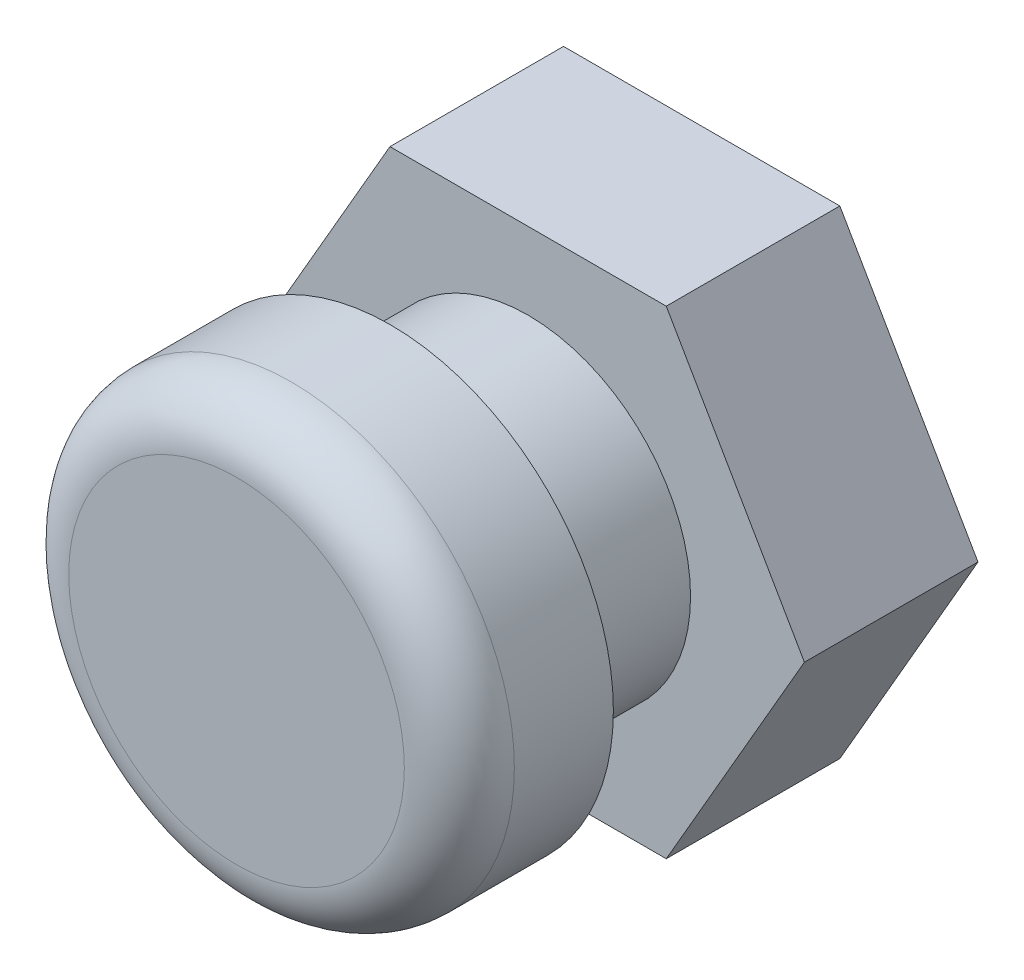
ISO-10303-21;
HEADER;
FILE_DESCRIPTION(('STEP AP214'),'2;1');
FILE_NAME('part.step','',(''),(''),'','','');
FILE_SCHEMA(('AUTOMOTIVE_DESIGN { 1 0 10303 214 1 1 1 1 }'));
ENDSEC;
DATA;
#1=APPLICATION_CONTEXT('core data for automotive mechanical design processes');
#2=APPLICATION_PROTOCOL_DEFINITION('international standard','automotive_design',2000,#1);
#3=PRODUCT_CONTEXT('',#1,'mechanical');
#4=PRODUCT('Part','Part','',(#3));
#5=PRODUCT_RELATED_PRODUCT_CATEGORY('part','',(#4));
#6=PRODUCT_DEFINITION_FORMATION('','',#4);
#7=PRODUCT_DEFINITION_CONTEXT('part definition',#1,'design');
#8=PRODUCT_DEFINITION('design','',#6,#7);
#9=PRODUCT_DEFINITION_SHAPE('','',#8);
#10=(LENGTH_UNIT() NAMED_UNIT(*) SI_UNIT(.MILLI.,.METRE.));
#11=(NAMED_UNIT(*) PLANE_ANGLE_UNIT() SI_UNIT($,.RADIAN.));
#12=(NAMED_UNIT(*) SI_UNIT($,.STERADIAN.) SOLID_ANGLE_UNIT());
#13=UNCERTAINTY_MEASURE_WITH_UNIT(LENGTH_MEASURE(1.E-05),#10,'distance_accuracy_value','');
#14=(GEOMETRIC_REPRESENTATION_CONTEXT(3) GLOBAL_UNCERTAINTY_ASSIGNED_CONTEXT((#13)) GLOBAL_UNIT_ASSIGNED_CONTEXT((#10,
#11,#12)) REPRESENTATION_CONTEXT('',''));
#15=CARTESIAN_POINT('',(0.,0.,0.));
#16=DIRECTION('',(0.,0.,1.));
#17=DIRECTION('',(1.,0.,0.));
#18=AXIS2_PLACEMENT_3D('',#15,#16,#17);
#19=CARTESIAN_POINT('',(0.,0.,0.));
#20=DIRECTION('',(0.,0.,1.));
#21=DIRECTION('',(1.,0.,0.));
#22=AXIS2_PLACEMENT_3D('',#19,#20,#21);
#23=PLANE('',#22);
#24=CARTESIAN_POINT('',(0.,0.,0.));
#25=DIRECTION('',(0.,0.,1.));
#26=DIRECTION('',(1.,0.,0.));
#27=AXIS2_PLACEMENT_3D('',#24,#25,#26);
#28=CIRCLE('',#27,5.1435);
#29=CARTESIAN_POINT('',(5.1435,0.,0.));
#30=VERTEX_POINT('',#29);
#31=EDGE_CURVE('E142',#30,#30,#28,.T.);
#32=ORIENTED_EDGE('',*,*,#31,.F.);
#33=EDGE_LOOP('',(#32));
#34=FACE_BOUND('',#33,.T.);
#35=CARTESIAN_POINT('',(0.,0.,0.));
#36=DIRECTION('',(0.,0.,1.));
#37=DIRECTION('',(1.,0.,0.));
#38=AXIS2_PLACEMENT_3D('',#35,#36,#37);
#39=CIRCLE('',#38,3.75);
#40=CARTESIAN_POINT('',(3.75,0.,0.));
#41=VERTEX_POINT('',#40);
#42=EDGE_CURVE('E145',#41,#41,#39,.F.);
#43=ORIENTED_EDGE('',*,*,#42,.F.);
#44=EDGE_LOOP('',(#43));
#45=FACE_BOUND('',#44,.T.);
#46=ADVANCED_FACE('F34',(#34,#45),#23,.F.);
#47=CARTESIAN_POINT('',(0.,0.,3.556));
#48=DIRECTION('',(0.,0.,-1.));
#49=DIRECTION('',(-1.,0.,0.));
#50=AXIS2_PLACEMENT_3D('',#47,#48,#49);
#51=CYLINDRICAL_SURFACE('',#50,5.1435);
#52=CARTESIAN_POINT('',(0.,0.,2.286));
#53=DIRECTION('',(0.,0.,1.));
#54=DIRECTION('',(1.,0.,0.));
#55=AXIS2_PLACEMENT_3D('',#52,#53,#54);
#56=CIRCLE('',#55,5.1435);
#57=CARTESIAN_POINT('',(5.1435,0.,2.286));
#58=VERTEX_POINT('',#57);
#59=EDGE_CURVE('E11',#58,#58,#56,.F.);
#60=ORIENTED_EDGE('',*,*,#59,.T.);
#61=EDGE_LOOP('',(#60));
#62=FACE_BOUND('',#61,.T.);
#63=ORIENTED_EDGE('',*,*,#31,.T.);
#64=EDGE_LOOP('',(#63));
#65=FACE_BOUND('',#64,.T.);
#66=ADVANCED_FACE('F161',(#62,#65),#51,.T.);
#67=CARTESIAN_POINT('',(0.,0.,3.556));
#68=DIRECTION('',(0.,0.,1.));
#69=DIRECTION('',(1.,0.,0.));
#70=AXIS2_PLACEMENT_3D('',#67,#68,#69);
#71=PLANE('',#70);
#72=CARTESIAN_POINT('',(0.,0.,3.556));
#73=DIRECTION('',(0.,0.,1.));
#74=DIRECTION('',(1.,0.,0.));
#75=AXIS2_PLACEMENT_3D('',#72,#73,#74);
#76=CIRCLE('',#75,3.8735);
#77=CARTESIAN_POINT('',(3.8735,0.,3.556));
#78=VERTEX_POINT('',#77);
#79=EDGE_CURVE('E43',#78,#78,#76,.T.);
#80=ORIENTED_EDGE('',*,*,#79,.T.);
#81=EDGE_LOOP('',(#80));
#82=FACE_BOUND('',#81,.T.);
#83=ADVANCED_FACE('F150',(#82),#71,.T.);
#84=CARTESIAN_POINT('',(0.,0.,-3.175));
#85=DIRECTION('',(0.,0.,1.));
#86=DIRECTION('',(1.,0.,0.));
#87=AXIS2_PLACEMENT_3D('',#84,#85,#86);
#88=CYLINDRICAL_SURFACE('',#87,3.75);
#89=CARTESIAN_POINT('',(0.,0.,-3.175));
#90=DIRECTION('',(0.,0.,-1.));
#91=DIRECTION('',(-1.,0.,0.));
#92=AXIS2_PLACEMENT_3D('',#89,#90,#91);
#93=CIRCLE('',#92,3.75);
#94=CARTESIAN_POINT('',(-3.75,0.,-3.175));
#95=VERTEX_POINT('',#94);
#96=EDGE_CURVE('E139',#95,#95,#93,.T.);
#97=ORIENTED_EDGE('',*,*,#96,.F.);
#98=EDGE_LOOP('',(#97));
#99=FACE_BOUND('',#98,.T.);
#100=ORIENTED_EDGE('',*,*,#42,.T.);
#101=EDGE_LOOP('',(#100));
#102=FACE_BOUND('',#101,.T.);
#103=ADVANCED_FACE('F173',(#99,#102),#88,.T.);
#104=CARTESIAN_POINT('',(3.18957156213809,-5.5245,-3.175));
#105=DIRECTION('',(0.,0.,-1.));
#106=DIRECTION('',(-1.,0.,0.));
#107=AXIS2_PLACEMENT_3D('',#104,#105,#106);
#108=PLANE('',#107);
#109=DIRECTION('',(-0.5,-0.866025403784439,0.));
#110=VECTOR('',#109,1.);
#111=CARTESIAN_POINT('',(6.37914312427618,0.,-3.175));
#112=LINE('',#111,#110);
#113=CARTESIAN_POINT('',(6.37914312427618,0.,-3.175));
#114=VERTEX_POINT('',#113);
#115=CARTESIAN_POINT('',(3.18957156213809,-5.5245,-3.175));
#116=VERTEX_POINT('',#115);
#117=EDGE_CURVE('E120',#114,#116,#112,.T.);
#118=ORIENTED_EDGE('',*,*,#117,.F.);
#119=DIRECTION('',(0.5,-0.866025403784439,0.));
#120=VECTOR('',#119,1.);
#121=CARTESIAN_POINT('',(3.18957156213809,5.5245,-3.175));
#122=LINE('',#121,#120);
#123=CARTESIAN_POINT('',(3.18957156213809,5.5245,-3.175));
#124=VERTEX_POINT('',#123);
#125=EDGE_CURVE('E80',#124,#114,#122,.T.);
#126=ORIENTED_EDGE('',*,*,#125,.F.);
#127=DIRECTION('',(1.,0.,0.));
#128=VECTOR('',#127,1.);
#129=CARTESIAN_POINT('',(-3.18957156213809,5.5245,-3.175));
#130=LINE('',#129,#128);
#131=CARTESIAN_POINT('',(-3.18957156213809,5.5245,-3.175));
#132=VERTEX_POINT('',#131);
#133=EDGE_CURVE('E74',#132,#124,#130,.T.);
#134=ORIENTED_EDGE('',*,*,#133,.F.);
#135=DIRECTION('',(0.5,0.866025403784439,0.));
#136=VECTOR('',#135,1.);
#137=CARTESIAN_POINT('',(-6.37914312427618,0.,-3.175));
#138=LINE('',#137,#136);
#139=CARTESIAN_POINT('',(-6.37914312427618,0.,-3.175));
#140=VERTEX_POINT('',#139);
#141=EDGE_CURVE('E110',#140,#132,#138,.T.);
#142=ORIENTED_EDGE('',*,*,#141,.F.);
#143=DIRECTION('',(-0.5,0.866025403784439,0.));
#144=VECTOR('',#143,1.);
#145=CARTESIAN_POINT('',(-3.18957156213809,-5.5245,-3.175));
#146=LINE('',#145,#144);
#147=CARTESIAN_POINT('',(-3.18957156213809,-5.5245,-3.175));
#148=VERTEX_POINT('',#147);
#149=EDGE_CURVE('E125',#148,#140,#146,.T.);
#150=ORIENTED_EDGE('',*,*,#149,.F.);
#151=DIRECTION('',(-1.,0.,0.));
#152=VECTOR('',#151,1.);
#153=CARTESIAN_POINT('',(3.18957156213809,-5.5245,-3.175));
#154=LINE('',#153,#152);
#155=EDGE_CURVE('E123',#116,#148,#154,.T.);
#156=ORIENTED_EDGE('',*,*,#155,.F.);
#157=EDGE_LOOP('',(#118,#126,#134,#142,#150,#156));
#158=FACE_BOUND('',#157,.T.);
#159=ORIENTED_EDGE('',*,*,#96,.T.);
#160=EDGE_LOOP('',(#159));
#161=FACE_BOUND('',#160,.T.);
#162=ADVANCED_FACE('F176',(#158,#161),#108,.F.);
#163=CARTESIAN_POINT('',(6.37914312427618,0.,-7.18242357225936));
#164=DIRECTION('',(-0.866025403784439,0.5,0.));
#165=DIRECTION('',(-0.5,-0.866025403784439,0.));
#166=AXIS2_PLACEMENT_3D('',#163,#164,#165);
#167=PLANE('',#166);
#168=ORIENTED_EDGE('',*,*,#117,.T.);
#169=DIRECTION('',(0.,0.,1.));
#170=VECTOR('',#169,1.);
#171=CARTESIAN_POINT('',(3.18957156213809,-5.5245,-7.18242357225936));
#172=LINE('',#171,#170);
#173=CARTESIAN_POINT('',(3.18957156213809,-5.5245,-7.18242357225936));
#174=VERTEX_POINT('',#173);
#175=EDGE_CURVE('E137',#174,#116,#172,.T.);
#176=ORIENTED_EDGE('',*,*,#175,.F.);
#177=DIRECTION('',(-0.5,-0.866025403784439,0.));
#178=VECTOR('',#177,1.);
#179=CARTESIAN_POINT('',(6.37914312427618,0.,-7.18242357225936));
#180=LINE('',#179,#178);
#181=CARTESIAN_POINT('',(6.37914312427618,0.,-7.18242357225936));
#182=VERTEX_POINT('',#181);
#183=EDGE_CURVE('E130',#182,#174,#180,.T.);
#184=ORIENTED_EDGE('',*,*,#183,.F.);
#185=DIRECTION('',(0.,0.,1.));
#186=VECTOR('',#185,1.);
#187=CARTESIAN_POINT('',(6.37914312427618,0.,-7.18242357225936));
#188=LINE('',#187,#186);
#189=EDGE_CURVE('E116',#182,#114,#188,.T.);
#190=ORIENTED_EDGE('',*,*,#189,.T.);
#191=EDGE_LOOP('',(#168,#176,#184,#190));
#192=FACE_BOUND('',#191,.T.);
#193=ADVANCED_FACE('F178',(#192),#167,.F.);
#194=CARTESIAN_POINT('',(3.18957156213809,-5.5245,-7.18242357225936));
#195=DIRECTION('',(0.,1.,0.));
#196=DIRECTION('',(0.,0.,1.));
#197=AXIS2_PLACEMENT_3D('',#194,#195,#196);
#198=PLANE('',#197);
#199=ORIENTED_EDGE('',*,*,#155,.T.);
#200=DIRECTION('',(0.,0.,1.));
#201=VECTOR('',#200,1.);
#202=CARTESIAN_POINT('',(-3.18957156213809,-5.5245,-7.18242357225936));
#203=LINE('',#202,#201);
#204=CARTESIAN_POINT('',(-3.18957156213809,-5.5245,-7.18242357225936));
#205=VERTEX_POINT('',#204);
#206=EDGE_CURVE('E134',#205,#148,#203,.T.);
#207=ORIENTED_EDGE('',*,*,#206,.F.);
#208=DIRECTION('',(-1.,0.,0.));
#209=VECTOR('',#208,1.);
#210=CARTESIAN_POINT('',(3.18957156213809,-5.5245,-7.18242357225936));
#211=LINE('',#210,#209);
#212=EDGE_CURVE('E89',#174,#205,#211,.T.);
#213=ORIENTED_EDGE('',*,*,#212,.F.);
#214=ORIENTED_EDGE('',*,*,#175,.T.);
#215=EDGE_LOOP('',(#199,#207,#213,#214));
#216=FACE_BOUND('',#215,.T.);
#217=ADVANCED_FACE('F181',(#216),#198,.F.);
#218=CARTESIAN_POINT('',(-3.18957156213809,-5.5245,-7.18242357225936));
#219=DIRECTION('',(0.866025403784439,0.5,0.));
#220=DIRECTION('',(-0.5,0.866025403784439,0.));
#221=AXIS2_PLACEMENT_3D('',#218,#219,#220);
#222=PLANE('',#221);
#223=ORIENTED_EDGE('',*,*,#149,.T.);
#224=DIRECTION('',(0.,0.,1.));
#225=VECTOR('',#224,1.);
#226=CARTESIAN_POINT('',(-6.37914312427618,0.,-7.18242357225936));
#227=LINE('',#226,#225);
#228=CARTESIAN_POINT('',(-6.37914312427618,0.,-7.18242357225936));
#229=VERTEX_POINT('',#228);
#230=EDGE_CURVE('E111',#229,#140,#227,.T.);
#231=ORIENTED_EDGE('',*,*,#230,.F.);
#232=DIRECTION('',(-0.5,0.866025403784439,0.));
#233=VECTOR('',#232,1.);
#234=CARTESIAN_POINT('',(-3.18957156213809,-5.5245,-7.18242357225936));
#235=LINE('',#234,#233);
#236=EDGE_CURVE('E102',#205,#229,#235,.T.);
#237=ORIENTED_EDGE('',*,*,#236,.F.);
#238=ORIENTED_EDGE('',*,*,#206,.T.);
#239=EDGE_LOOP('',(#223,#231,#237,#238));
#240=FACE_BOUND('',#239,.T.);
#241=ADVANCED_FACE('F185',(#240),#222,.F.);
#242=CARTESIAN_POINT('',(-6.37914312427618,0.,-7.18242357225936));
#243=DIRECTION('',(0.866025403784439,-0.5,0.));
#244=DIRECTION('',(0.5,0.866025403784439,0.));
#245=AXIS2_PLACEMENT_3D('',#242,#243,#244);
#246=PLANE('',#245);
#247=ORIENTED_EDGE('',*,*,#141,.T.);
#248=DIRECTION('',(0.,0.,1.));
#249=VECTOR('',#248,1.);
#250=CARTESIAN_POINT('',(-3.18957156213809,5.5245,-7.18242357225936));
#251=LINE('',#250,#249);
#252=CARTESIAN_POINT('',(-3.18957156213809,5.5245,-7.18242357225936));
#253=VERTEX_POINT('',#252);
#254=EDGE_CURVE('E107',#253,#132,#251,.T.);
#255=ORIENTED_EDGE('',*,*,#254,.F.);
#256=DIRECTION('',(0.5,0.866025403784439,0.));
#257=VECTOR('',#256,1.);
#258=CARTESIAN_POINT('',(-6.37914312427618,0.,-7.18242357225936));
#259=LINE('',#258,#257);
#260=EDGE_CURVE('E96',#229,#253,#259,.T.);
#261=ORIENTED_EDGE('',*,*,#260,.F.);
#262=ORIENTED_EDGE('',*,*,#230,.T.);
#263=EDGE_LOOP('',(#247,#255,#261,#262));
#264=FACE_BOUND('',#263,.T.);
#265=ADVANCED_FACE('F108',(#264),#246,.F.);
#266=CARTESIAN_POINT('',(-3.18957156213809,5.5245,-7.18242357225936));
#267=DIRECTION('',(0.,-1.,0.));
#268=DIRECTION('',(0.,0.,-1.));
#269=AXIS2_PLACEMENT_3D('',#266,#267,#268);
#270=PLANE('',#269);
#271=ORIENTED_EDGE('',*,*,#133,.T.);
#272=DIRECTION('',(0.,0.,1.));
#273=VECTOR('',#272,1.);
#274=CARTESIAN_POINT('',(3.18957156213809,5.5245,-7.18242357225936));
#275=LINE('',#274,#273);
#276=CARTESIAN_POINT('',(3.18957156213809,5.5245,-7.18242357225936));
#277=VERTEX_POINT('',#276);
#278=EDGE_CURVE('E112',#277,#124,#275,.T.);
#279=ORIENTED_EDGE('',*,*,#278,.F.);
#280=DIRECTION('',(1.,0.,0.));
#281=VECTOR('',#280,1.);
#282=CARTESIAN_POINT('',(-3.18957156213809,5.5245,-7.18242357225936));
#283=LINE('',#282,#281);
#284=EDGE_CURVE('E100',#253,#277,#283,.T.);
#285=ORIENTED_EDGE('',*,*,#284,.F.);
#286=ORIENTED_EDGE('',*,*,#254,.T.);
#287=EDGE_LOOP('',(#271,#279,#285,#286));
#288=FACE_BOUND('',#287,.T.);
#289=ADVANCED_FACE('F114',(#288),#270,.F.);
#290=CARTESIAN_POINT('',(3.18957156213809,5.5245,-7.18242357225936));
#291=DIRECTION('',(-0.866025403784439,-0.5,0.));
#292=DIRECTION('',(0.5,-0.866025403784439,0.));
#293=AXIS2_PLACEMENT_3D('',#290,#291,#292);
#294=PLANE('',#293);
#295=ORIENTED_EDGE('',*,*,#125,.T.);
#296=ORIENTED_EDGE('',*,*,#189,.F.);
#297=DIRECTION('',(0.5,-0.866025403784439,0.));
#298=VECTOR('',#297,1.);
#299=CARTESIAN_POINT('',(3.18957156213809,5.5245,-7.18242357225936));
#300=LINE('',#299,#298);
#301=EDGE_CURVE('E51',#277,#182,#300,.T.);
#302=ORIENTED_EDGE('',*,*,#301,.F.);
#303=ORIENTED_EDGE('',*,*,#278,.T.);
#304=EDGE_LOOP('',(#295,#296,#302,#303));
#305=FACE_BOUND('',#304,.T.);
#306=ADVANCED_FACE('F157',(#305),#294,.F.);
#307=CARTESIAN_POINT('',(3.18957156213809,-5.5245,-7.18242357225936));
#308=DIRECTION('',(0.,0.,-1.));
#309=DIRECTION('',(-1.,0.,0.));
#310=AXIS2_PLACEMENT_3D('',#307,#308,#309);
#311=PLANE('',#310);
#312=ORIENTED_EDGE('',*,*,#183,.T.);
#313=ORIENTED_EDGE('',*,*,#212,.T.);
#314=ORIENTED_EDGE('',*,*,#236,.T.);
#315=ORIENTED_EDGE('',*,*,#260,.T.);
#316=ORIENTED_EDGE('',*,*,#284,.T.);
#317=ORIENTED_EDGE('',*,*,#301,.T.);
#318=EDGE_LOOP('',(#312,#313,#314,#315,#316,#317));
#319=FACE_BOUND('',#318,.T.);
#320=ADVANCED_FACE('F98',(#319),#311,.T.);
#321=CARTESIAN_POINT('',(0.,0.,2.286));
#322=DIRECTION('',(0.,0.,1.));
#323=DIRECTION('',(1.,0.,0.));
#324=AXIS2_PLACEMENT_3D('',#321,#322,#323);
#325=TOROIDAL_SURFACE('',#324,3.8735,1.27);
#326=ORIENTED_EDGE('',*,*,#59,.F.);
#327=EDGE_LOOP('',(#326));
#328=FACE_BOUND('',#327,.T.);
#329=ORIENTED_EDGE('',*,*,#79,.F.);
#330=EDGE_LOOP('',(#329));
#331=FACE_BOUND('',#330,.T.);
#332=ADVANCED_FACE('F36',(#328,#331),#325,.T.);
#333=CLOSED_SHELL('',(#46,#66,#83,#103,#162,#193,#217,#241,#265,#289,#306,#320,#332));
#334=MANIFOLD_SOLID_BREP('B2',#333);
#335=ADVANCED_BREP_SHAPE_REPRESENTATION('',(#18,#334),#14);
#336=SHAPE_DEFINITION_REPRESENTATION(#9,#335);
ENDSEC;
END-ISO-10303-21;
